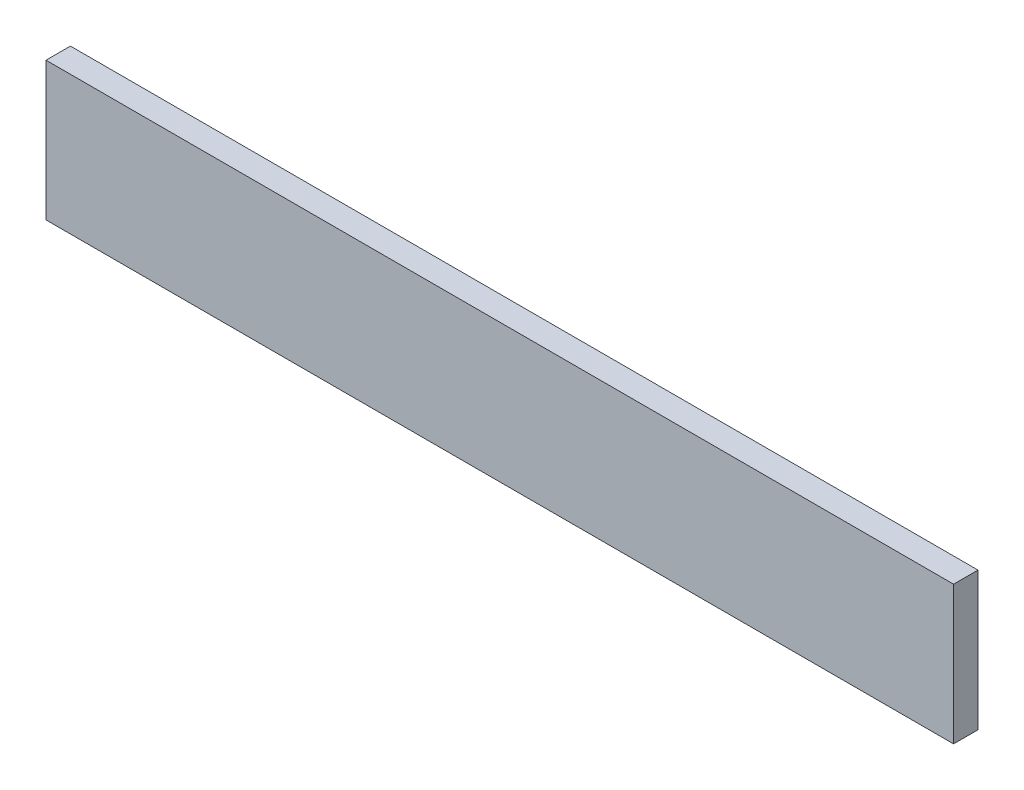
ISO-10303-21;
HEADER;
FILE_DESCRIPTION(('STEP AP214'),'2;1');
FILE_NAME('part.step','',(''),(''),'','','');
FILE_SCHEMA(('AUTOMOTIVE_DESIGN { 1 0 10303 214 1 1 1 1 }'));
ENDSEC;
DATA;
#1=APPLICATION_CONTEXT('core data for automotive mechanical design processes');
#2=APPLICATION_PROTOCOL_DEFINITION('international standard','automotive_design',2000,#1);
#3=PRODUCT_CONTEXT('',#1,'mechanical');
#4=PRODUCT('Part','Part','',(#3));
#5=PRODUCT_RELATED_PRODUCT_CATEGORY('part','',(#4));
#6=PRODUCT_DEFINITION_FORMATION('','',#4);
#7=PRODUCT_DEFINITION_CONTEXT('part definition',#1,'design');
#8=PRODUCT_DEFINITION('design','',#6,#7);
#9=PRODUCT_DEFINITION_SHAPE('','',#8);
#10=(LENGTH_UNIT() NAMED_UNIT(*) SI_UNIT(.MILLI.,.METRE.));
#11=(NAMED_UNIT(*) PLANE_ANGLE_UNIT() SI_UNIT($,.RADIAN.));
#12=(NAMED_UNIT(*) SI_UNIT($,.STERADIAN.) SOLID_ANGLE_UNIT());
#13=UNCERTAINTY_MEASURE_WITH_UNIT(LENGTH_MEASURE(1.E-05),#10,'distance_accuracy_value','');
#14=(GEOMETRIC_REPRESENTATION_CONTEXT(3) GLOBAL_UNCERTAINTY_ASSIGNED_CONTEXT((#13)) GLOBAL_UNIT_ASSIGNED_CONTEXT((#10,
#11,#12)) REPRESENTATION_CONTEXT('',''));
#15=CARTESIAN_POINT('',(0.,0.,0.));
#16=DIRECTION('',(0.,0.,1.));
#17=DIRECTION('',(1.,0.,0.));
#18=AXIS2_PLACEMENT_3D('',#15,#16,#17);
#19=CARTESIAN_POINT('',(-18.6182,-2.8702,1.));
#20=DIRECTION('',(1.,0.,0.));
#21=DIRECTION('',(0.,0.,-1.));
#22=AXIS2_PLACEMENT_3D('',#19,#20,#21);
#23=PLANE('',#22);
#24=DIRECTION('',(0.,-1.,0.));
#25=VECTOR('',#24,1.);
#26=CARTESIAN_POINT('',(-18.6182,-2.8702,0.));
#27=LINE('',#26,#25);
#28=CARTESIAN_POINT('',(-18.6182,2.794,0.));
#29=VERTEX_POINT('',#28);
#30=CARTESIAN_POINT('',(-18.6182,-2.8702,0.));
#31=VERTEX_POINT('',#30);
#32=EDGE_CURVE('E95',#29,#31,#27,.T.);
#33=ORIENTED_EDGE('',*,*,#32,.T.);
#34=DIRECTION('',(0.,0.,-1.));
#35=VECTOR('',#34,1.);
#36=CARTESIAN_POINT('',(-18.6182,-2.8702,1.));
#37=LINE('',#36,#35);
#38=CARTESIAN_POINT('',(-18.6182,-2.8702,1.));
#39=VERTEX_POINT('',#38);
#40=EDGE_CURVE('E11',#39,#31,#37,.T.);
#41=ORIENTED_EDGE('',*,*,#40,.F.);
#42=DIRECTION('',(0.,-1.,0.));
#43=VECTOR('',#42,1.);
#44=CARTESIAN_POINT('',(-18.6182,-2.8702,1.));
#45=LINE('',#44,#43);
#46=CARTESIAN_POINT('',(-18.6182,2.794,1.));
#47=VERTEX_POINT('',#46);
#48=EDGE_CURVE('E83',#47,#39,#45,.T.);
#49=ORIENTED_EDGE('',*,*,#48,.F.);
#50=DIRECTION('',(0.,0.,-1.));
#51=VECTOR('',#50,1.);
#52=CARTESIAN_POINT('',(-18.6182,2.794,1.));
#53=LINE('',#52,#51);
#54=EDGE_CURVE('E91',#47,#29,#53,.T.);
#55=ORIENTED_EDGE('',*,*,#54,.T.);
#56=EDGE_LOOP('',(#33,#41,#49,#55));
#57=FACE_BOUND('',#56,.T.);
#58=ADVANCED_FACE('F32',(#57),#23,.F.);
#59=CARTESIAN_POINT('',(18.542,-2.8702,1.));
#60=DIRECTION('',(0.,1.,0.));
#61=DIRECTION('',(0.,0.,1.));
#62=AXIS2_PLACEMENT_3D('',#59,#60,#61);
#63=PLANE('',#62);
#64=DIRECTION('',(1.,0.,0.));
#65=VECTOR('',#64,1.);
#66=CARTESIAN_POINT('',(18.542,-2.8702,0.));
#67=LINE('',#66,#65);
#68=CARTESIAN_POINT('',(18.542,-2.8702,0.));
#69=VERTEX_POINT('',#68);
#70=EDGE_CURVE('E87',#31,#69,#67,.T.);
#71=ORIENTED_EDGE('',*,*,#70,.T.);
#72=DIRECTION('',(0.,0.,-1.));
#73=VECTOR('',#72,1.);
#74=CARTESIAN_POINT('',(18.542,-2.8702,1.));
#75=LINE('',#74,#73);
#76=CARTESIAN_POINT('',(18.542,-2.8702,1.));
#77=VERTEX_POINT('',#76);
#78=EDGE_CURVE('E40',#77,#69,#75,.T.);
#79=ORIENTED_EDGE('',*,*,#78,.F.);
#80=DIRECTION('',(1.,0.,0.));
#81=VECTOR('',#80,1.);
#82=CARTESIAN_POINT('',(18.542,-2.8702,1.));
#83=LINE('',#82,#81);
#84=EDGE_CURVE('E78',#39,#77,#83,.T.);
#85=ORIENTED_EDGE('',*,*,#84,.F.);
#86=ORIENTED_EDGE('',*,*,#40,.T.);
#87=EDGE_LOOP('',(#71,#79,#85,#86));
#88=FACE_BOUND('',#87,.T.);
#89=ADVANCED_FACE('F86',(#88),#63,.F.);
#90=CARTESIAN_POINT('',(18.542,2.794,1.));
#91=DIRECTION('',(-1.,0.,0.));
#92=DIRECTION('',(0.,0.,1.));
#93=AXIS2_PLACEMENT_3D('',#90,#91,#92);
#94=PLANE('',#93);
#95=DIRECTION('',(0.,1.,0.));
#96=VECTOR('',#95,1.);
#97=CARTESIAN_POINT('',(18.542,2.794,0.));
#98=LINE('',#97,#96);
#99=CARTESIAN_POINT('',(18.542,2.794,0.));
#100=VERTEX_POINT('',#99);
#101=EDGE_CURVE('E65',#69,#100,#98,.T.);
#102=ORIENTED_EDGE('',*,*,#101,.T.);
#103=DIRECTION('',(0.,0.,-1.));
#104=VECTOR('',#103,1.);
#105=CARTESIAN_POINT('',(18.542,2.794,1.));
#106=LINE('',#105,#104);
#107=CARTESIAN_POINT('',(18.542,2.794,1.));
#108=VERTEX_POINT('',#107);
#109=EDGE_CURVE('E88',#108,#100,#106,.T.);
#110=ORIENTED_EDGE('',*,*,#109,.F.);
#111=DIRECTION('',(0.,1.,0.));
#112=VECTOR('',#111,1.);
#113=CARTESIAN_POINT('',(18.542,2.794,1.));
#114=LINE('',#113,#112);
#115=EDGE_CURVE('E81',#77,#108,#114,.T.);
#116=ORIENTED_EDGE('',*,*,#115,.F.);
#117=ORIENTED_EDGE('',*,*,#78,.T.);
#118=EDGE_LOOP('',(#102,#110,#116,#117));
#119=FACE_BOUND('',#118,.T.);
#120=ADVANCED_FACE('F89',(#119),#94,.F.);
#121=CARTESIAN_POINT('',(-18.6182,2.794,1.));
#122=DIRECTION('',(0.,-1.,0.));
#123=DIRECTION('',(0.,0.,-1.));
#124=AXIS2_PLACEMENT_3D('',#121,#122,#123);
#125=PLANE('',#124);
#126=DIRECTION('',(-1.,0.,0.));
#127=VECTOR('',#126,1.);
#128=CARTESIAN_POINT('',(-18.6182,2.794,0.));
#129=LINE('',#128,#127);
#130=EDGE_CURVE('E71',#100,#29,#129,.T.);
#131=ORIENTED_EDGE('',*,*,#130,.T.);
#132=ORIENTED_EDGE('',*,*,#54,.F.);
#133=DIRECTION('',(-1.,0.,0.));
#134=VECTOR('',#133,1.);
#135=CARTESIAN_POINT('',(-18.6182,2.794,1.));
#136=LINE('',#135,#134);
#137=EDGE_CURVE('E48',#108,#47,#136,.T.);
#138=ORIENTED_EDGE('',*,*,#137,.F.);
#139=ORIENTED_EDGE('',*,*,#109,.T.);
#140=EDGE_LOOP('',(#131,#132,#138,#139));
#141=FACE_BOUND('',#140,.T.);
#142=ADVANCED_FACE('F102',(#141),#125,.F.);
#143=CARTESIAN_POINT('',(0.,0.,1.));
#144=DIRECTION('',(0.,0.,-1.));
#145=DIRECTION('',(-1.,0.,0.));
#146=AXIS2_PLACEMENT_3D('',#143,#144,#145);
#147=PLANE('',#146);
#148=ORIENTED_EDGE('',*,*,#48,.T.);
#149=ORIENTED_EDGE('',*,*,#84,.T.);
#150=ORIENTED_EDGE('',*,*,#115,.T.);
#151=ORIENTED_EDGE('',*,*,#137,.T.);
#152=EDGE_LOOP('',(#148,#149,#150,#151));
#153=FACE_BOUND('',#152,.T.);
#154=ADVANCED_FACE('F79',(#153),#147,.F.);
#155=CARTESIAN_POINT('',(0.,0.,0.));
#156=DIRECTION('',(0.,0.,-1.));
#157=DIRECTION('',(-1.,0.,0.));
#158=AXIS2_PLACEMENT_3D('',#155,#156,#157);
#159=PLANE('',#158);
#160=ORIENTED_EDGE('',*,*,#32,.F.);
#161=ORIENTED_EDGE('',*,*,#130,.F.);
#162=ORIENTED_EDGE('',*,*,#101,.F.);
#163=ORIENTED_EDGE('',*,*,#70,.F.);
#164=EDGE_LOOP('',(#160,#161,#162,#163));
#165=FACE_BOUND('',#164,.T.);
#166=ADVANCED_FACE('F105',(#165),#159,.T.);
#167=CLOSED_SHELL('',(#58,#89,#120,#142,#154,#166));
#168=MANIFOLD_SOLID_BREP('B2',#167);
#169=ADVANCED_BREP_SHAPE_REPRESENTATION('',(#18,#168),#14);
#170=SHAPE_DEFINITION_REPRESENTATION(#9,#169);
ENDSEC;
END-ISO-10303-21;
